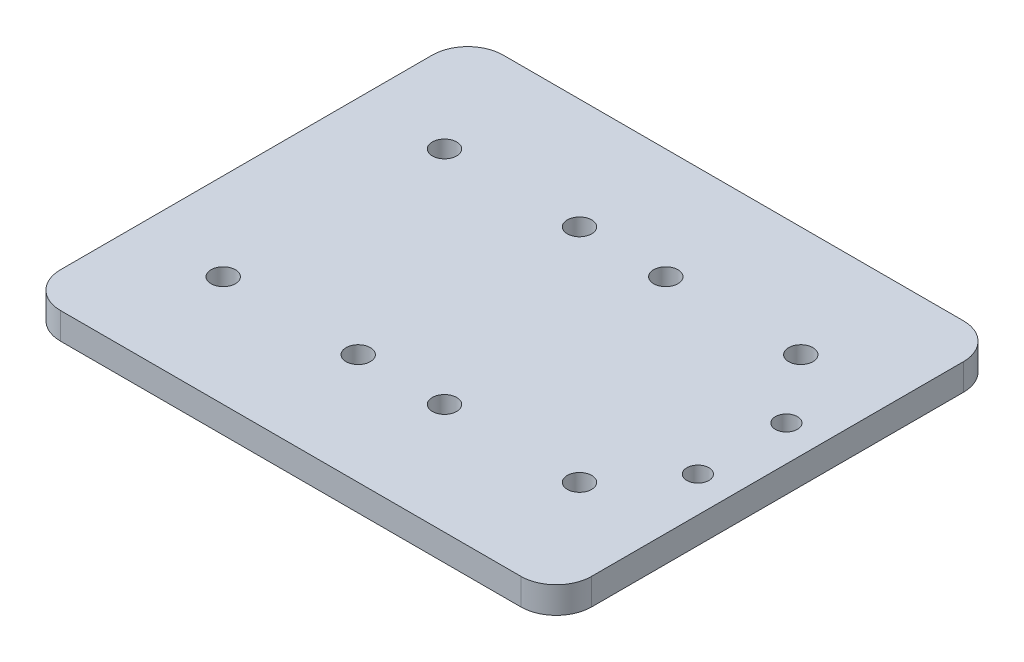
ISO-10303-21;
HEADER;
FILE_DESCRIPTION(('STEP AP214'),'2;1');
FILE_NAME('part.step','',(''),(''),'','','');
FILE_SCHEMA(('AUTOMOTIVE_DESIGN { 1 0 10303 214 1 1 1 1 }'));
ENDSEC;
DATA;
#1=APPLICATION_CONTEXT('core data for automotive mechanical design processes');
#2=APPLICATION_PROTOCOL_DEFINITION('international standard','automotive_design',2000,#1);
#3=PRODUCT_CONTEXT('',#1,'mechanical');
#4=PRODUCT('Part','Part','',(#3));
#5=PRODUCT_RELATED_PRODUCT_CATEGORY('part','',(#4));
#6=PRODUCT_DEFINITION_FORMATION('','',#4);
#7=PRODUCT_DEFINITION_CONTEXT('part definition',#1,'design');
#8=PRODUCT_DEFINITION('design','',#6,#7);
#9=PRODUCT_DEFINITION_SHAPE('','',#8);
#10=(LENGTH_UNIT() NAMED_UNIT(*) SI_UNIT(.MILLI.,.METRE.));
#11=(NAMED_UNIT(*) PLANE_ANGLE_UNIT() SI_UNIT($,.RADIAN.));
#12=(NAMED_UNIT(*) SI_UNIT($,.STERADIAN.) SOLID_ANGLE_UNIT());
#13=UNCERTAINTY_MEASURE_WITH_UNIT(LENGTH_MEASURE(1.E-05),#10,'distance_accuracy_value','');
#14=(GEOMETRIC_REPRESENTATION_CONTEXT(3) GLOBAL_UNCERTAINTY_ASSIGNED_CONTEXT((#13)) GLOBAL_UNIT_ASSIGNED_CONTEXT((#10,
#11,#12)) REPRESENTATION_CONTEXT('',''));
#15=CARTESIAN_POINT('',(0.,0.,0.));
#16=DIRECTION('',(0.,0.,1.));
#17=DIRECTION('',(1.,0.,0.));
#18=AXIS2_PLACEMENT_3D('',#15,#16,#17);
#19=CARTESIAN_POINT('',(60.,6.,-50.));
#20=DIRECTION('',(-1.,0.,0.));
#21=DIRECTION('',(0.,0.,1.));
#22=AXIS2_PLACEMENT_3D('',#19,#20,#21);
#23=PLANE('',#22);
#24=DIRECTION('',(0.,0.,-1.));
#25=VECTOR('',#24,1.);
#26=CARTESIAN_POINT('',(60.,0.,-50.));
#27=LINE('',#26,#25);
#28=CARTESIAN_POINT('',(60.,0.,42.));
#29=VERTEX_POINT('',#28);
#30=CARTESIAN_POINT('',(60.,0.,-42.));
#31=VERTEX_POINT('',#30);
#32=EDGE_CURVE('E133',#29,#31,#27,.T.);
#33=ORIENTED_EDGE('',*,*,#32,.T.);
#34=DIRECTION('',(0.,-1.,0.));
#35=VECTOR('',#34,1.);
#36=CARTESIAN_POINT('',(60.,6.,-42.));
#37=LINE('',#36,#35);
#38=CARTESIAN_POINT('',(60.,6.,-42.));
#39=VERTEX_POINT('',#38);
#40=EDGE_CURVE('E156',#31,#39,#37,.F.);
#41=ORIENTED_EDGE('',*,*,#40,.T.);
#42=DIRECTION('',(0.,0.,-1.));
#43=VECTOR('',#42,1.);
#44=CARTESIAN_POINT('',(60.,6.,-50.));
#45=LINE('',#44,#43);
#46=CARTESIAN_POINT('',(60.,6.,42.));
#47=VERTEX_POINT('',#46);
#48=EDGE_CURVE('E131',#47,#39,#45,.T.);
#49=ORIENTED_EDGE('',*,*,#48,.F.);
#50=DIRECTION('',(0.,-1.,0.));
#51=VECTOR('',#50,1.);
#52=CARTESIAN_POINT('',(60.,6.,42.));
#53=LINE('',#52,#51);
#54=EDGE_CURVE('E153',#47,#29,#53,.T.);
#55=ORIENTED_EDGE('',*,*,#54,.T.);
#56=EDGE_LOOP('',(#33,#41,#49,#55));
#57=FACE_BOUND('',#56,.T.);
#58=ADVANCED_FACE('F38',(#57),#23,.F.);
#59=CARTESIAN_POINT('',(-60.,6.,-50.));
#60=DIRECTION('',(0.,0.,1.));
#61=DIRECTION('',(1.,0.,0.));
#62=AXIS2_PLACEMENT_3D('',#59,#60,#61);
#63=PLANE('',#62);
#64=DIRECTION('',(-1.,0.,0.));
#65=VECTOR('',#64,1.);
#66=CARTESIAN_POINT('',(-60.,0.,-50.));
#67=LINE('',#66,#65);
#68=CARTESIAN_POINT('',(52.,0.,-50.));
#69=VERTEX_POINT('',#68);
#70=CARTESIAN_POINT('',(-52.,0.,-50.));
#71=VERTEX_POINT('',#70);
#72=EDGE_CURVE('E129',#69,#71,#67,.T.);
#73=ORIENTED_EDGE('',*,*,#72,.T.);
#74=DIRECTION('',(0.,-1.,0.));
#75=VECTOR('',#74,1.);
#76=CARTESIAN_POINT('',(-52.,6.,-50.));
#77=LINE('',#76,#75);
#78=CARTESIAN_POINT('',(-52.,6.,-50.));
#79=VERTEX_POINT('',#78);
#80=EDGE_CURVE('E108',#71,#79,#77,.F.);
#81=ORIENTED_EDGE('',*,*,#80,.T.);
#82=DIRECTION('',(-1.,0.,0.));
#83=VECTOR('',#82,1.);
#84=CARTESIAN_POINT('',(-60.,6.,-50.));
#85=LINE('',#84,#83);
#86=CARTESIAN_POINT('',(52.,6.,-50.));
#87=VERTEX_POINT('',#86);
#88=EDGE_CURVE('E172',#87,#79,#85,.T.);
#89=ORIENTED_EDGE('',*,*,#88,.F.);
#90=DIRECTION('',(0.,-1.,0.));
#91=VECTOR('',#90,1.);
#92=CARTESIAN_POINT('',(52.,6.,-50.));
#93=LINE('',#92,#91);
#94=EDGE_CURVE('E113',#87,#69,#93,.T.);
#95=ORIENTED_EDGE('',*,*,#94,.T.);
#96=EDGE_LOOP('',(#73,#81,#89,#95));
#97=FACE_BOUND('',#96,.T.);
#98=ADVANCED_FACE('F275',(#97),#63,.F.);
#99=CARTESIAN_POINT('',(-60.,6.,-50.));
#100=DIRECTION('',(1.,0.,0.));
#101=DIRECTION('',(0.,0.,-1.));
#102=AXIS2_PLACEMENT_3D('',#99,#100,#101);
#103=PLANE('',#102);
#104=DIRECTION('',(0.,0.,1.));
#105=VECTOR('',#104,1.);
#106=CARTESIAN_POINT('',(-60.,6.,-50.));
#107=LINE('',#106,#105);
#108=CARTESIAN_POINT('',(-60.,6.,-42.));
#109=VERTEX_POINT('',#108);
#110=CARTESIAN_POINT('',(-60.,6.,42.));
#111=VERTEX_POINT('',#110);
#112=EDGE_CURVE('E122',#109,#111,#107,.T.);
#113=ORIENTED_EDGE('',*,*,#112,.F.);
#114=DIRECTION('',(0.,-1.,0.));
#115=VECTOR('',#114,1.);
#116=CARTESIAN_POINT('',(-60.,6.,-42.));
#117=LINE('',#116,#115);
#118=CARTESIAN_POINT('',(-60.,0.,-42.));
#119=VERTEX_POINT('',#118);
#120=EDGE_CURVE('E107',#109,#119,#117,.T.);
#121=ORIENTED_EDGE('',*,*,#120,.T.);
#122=DIRECTION('',(0.,0.,1.));
#123=VECTOR('',#122,1.);
#124=CARTESIAN_POINT('',(-60.,0.,-50.));
#125=LINE('',#124,#123);
#126=CARTESIAN_POINT('',(-60.,0.,42.));
#127=VERTEX_POINT('',#126);
#128=EDGE_CURVE('E120',#119,#127,#125,.T.);
#129=ORIENTED_EDGE('',*,*,#128,.T.);
#130=DIRECTION('',(0.,-1.,0.));
#131=VECTOR('',#130,1.);
#132=CARTESIAN_POINT('',(-60.,6.,42.));
#133=LINE('',#132,#131);
#134=EDGE_CURVE('E124',#127,#111,#133,.F.);
#135=ORIENTED_EDGE('',*,*,#134,.T.);
#136=EDGE_LOOP('',(#113,#121,#129,#135));
#137=FACE_BOUND('',#136,.T.);
#138=ADVANCED_FACE('F119',(#137),#103,.F.);
#139=CARTESIAN_POINT('',(-60.,6.,50.));
#140=DIRECTION('',(0.,0.,-1.));
#141=DIRECTION('',(-1.,0.,0.));
#142=AXIS2_PLACEMENT_3D('',#139,#140,#141);
#143=PLANE('',#142);
#144=DIRECTION('',(1.,0.,0.));
#145=VECTOR('',#144,1.);
#146=CARTESIAN_POINT('',(-60.,0.,50.));
#147=LINE('',#146,#145);
#148=CARTESIAN_POINT('',(-52.,0.,50.));
#149=VERTEX_POINT('',#148);
#150=CARTESIAN_POINT('',(52.,0.,50.));
#151=VERTEX_POINT('',#150);
#152=EDGE_CURVE('E128',#149,#151,#147,.T.);
#153=ORIENTED_EDGE('',*,*,#152,.T.);
#154=DIRECTION('',(0.,-1.,0.));
#155=VECTOR('',#154,1.);
#156=CARTESIAN_POINT('',(52.,6.,50.));
#157=LINE('',#156,#155);
#158=CARTESIAN_POINT('',(52.,6.,50.));
#159=VERTEX_POINT('',#158);
#160=EDGE_CURVE('E11',#151,#159,#157,.F.);
#161=ORIENTED_EDGE('',*,*,#160,.T.);
#162=DIRECTION('',(1.,0.,0.));
#163=VECTOR('',#162,1.);
#164=CARTESIAN_POINT('',(-60.,6.,50.));
#165=LINE('',#164,#163);
#166=CARTESIAN_POINT('',(-52.,6.,50.));
#167=VERTEX_POINT('',#166);
#168=EDGE_CURVE('E137',#167,#159,#165,.T.);
#169=ORIENTED_EDGE('',*,*,#168,.F.);
#170=DIRECTION('',(0.,-1.,0.));
#171=VECTOR('',#170,1.);
#172=CARTESIAN_POINT('',(-52.,6.,50.));
#173=LINE('',#172,#171);
#174=EDGE_CURVE('E46',#167,#149,#173,.T.);
#175=ORIENTED_EDGE('',*,*,#174,.T.);
#176=EDGE_LOOP('',(#153,#161,#169,#175));
#177=FACE_BOUND('',#176,.T.);
#178=ADVANCED_FACE('F159',(#177),#143,.F.);
#179=CARTESIAN_POINT('',(0.,6.,0.));
#180=DIRECTION('',(0.,1.,0.));
#181=DIRECTION('',(0.,0.,1.));
#182=AXIS2_PLACEMENT_3D('',#179,#180,#181);
#183=PLANE('',#182);
#184=CARTESIAN_POINT('',(52.,6.,-10.));
#185=DIRECTION('',(0.,1.,0.));
#186=DIRECTION('',(0.,0.,1.));
#187=AXIS2_PLACEMENT_3D('',#184,#185,#186);
#188=CIRCLE('',#187,2.5);
#189=CARTESIAN_POINT('',(52.,6.,-7.5));
#190=VERTEX_POINT('',#189);
#191=EDGE_CURVE('E236',#190,#190,#188,.T.);
#192=ORIENTED_EDGE('',*,*,#191,.F.);
#193=EDGE_LOOP('',(#192));
#194=FACE_BOUND('',#193,.T.);
#195=CARTESIAN_POINT('',(52.,6.,9.99999999999999));
#196=DIRECTION('',(0.,1.,0.));
#197=DIRECTION('',(0.,0.,1.));
#198=AXIS2_PLACEMENT_3D('',#195,#196,#197);
#199=CIRCLE('',#198,2.5);
#200=CARTESIAN_POINT('',(52.,6.,12.5));
#201=VERTEX_POINT('',#200);
#202=EDGE_CURVE('E230',#201,#201,#199,.T.);
#203=ORIENTED_EDGE('',*,*,#202,.F.);
#204=EDGE_LOOP('',(#203));
#205=FACE_BOUND('',#204,.T.);
#206=CARTESIAN_POINT('',(-40.25,6.,25.));
#207=DIRECTION('',(0.,1.,0.));
#208=DIRECTION('',(0.,0.,-1.));
#209=AXIS2_PLACEMENT_3D('',#206,#207,#208);
#210=CIRCLE('',#209,2.75);
#211=CARTESIAN_POINT('',(-40.25,6.,22.25));
#212=VERTEX_POINT('',#211);
#213=EDGE_CURVE('E200',#212,#212,#210,.T.);
#214=ORIENTED_EDGE('',*,*,#213,.F.);
#215=EDGE_LOOP('',(#214));
#216=FACE_BOUND('',#215,.T.);
#217=CARTESIAN_POINT('',(40.25,6.,25.));
#218=DIRECTION('',(0.,1.,0.));
#219=DIRECTION('',(0.,0.,1.));
#220=AXIS2_PLACEMENT_3D('',#217,#218,#219);
#221=CIRCLE('',#220,2.75);
#222=CARTESIAN_POINT('',(40.25,6.,27.75));
#223=VERTEX_POINT('',#222);
#224=EDGE_CURVE('E207',#223,#223,#221,.T.);
#225=ORIENTED_EDGE('',*,*,#224,.F.);
#226=EDGE_LOOP('',(#225));
#227=FACE_BOUND('',#226,.T.);
#228=CARTESIAN_POINT('',(9.75000000000001,6.,25.));
#229=DIRECTION('',(0.,1.,0.));
#230=DIRECTION('',(0.,0.,1.));
#231=AXIS2_PLACEMENT_3D('',#228,#229,#230);
#232=CIRCLE('',#231,2.75);
#233=CARTESIAN_POINT('',(9.75000000000001,6.,27.75));
#234=VERTEX_POINT('',#233);
#235=EDGE_CURVE('E188',#234,#234,#232,.T.);
#236=ORIENTED_EDGE('',*,*,#235,.F.);
#237=EDGE_LOOP('',(#236));
#238=FACE_BOUND('',#237,.T.);
#239=CARTESIAN_POINT('',(40.25,6.,-25.));
#240=DIRECTION('',(0.,1.,0.));
#241=DIRECTION('',(0.,0.,1.));
#242=AXIS2_PLACEMENT_3D('',#239,#240,#241);
#243=CIRCLE('',#242,2.74999999999999);
#244=CARTESIAN_POINT('',(40.25,6.,-22.25));
#245=VERTEX_POINT('',#244);
#246=EDGE_CURVE('E195',#245,#245,#243,.T.);
#247=ORIENTED_EDGE('',*,*,#246,.F.);
#248=EDGE_LOOP('',(#247));
#249=FACE_BOUND('',#248,.T.);
#250=CARTESIAN_POINT('',(-9.75,6.,-25.));
#251=DIRECTION('',(0.,1.,0.));
#252=DIRECTION('',(0.,0.,-1.));
#253=AXIS2_PLACEMENT_3D('',#250,#251,#252);
#254=CIRCLE('',#253,2.75);
#255=CARTESIAN_POINT('',(-9.75,6.,-27.75));
#256=VERTEX_POINT('',#255);
#257=EDGE_CURVE('E224',#256,#256,#254,.T.);
#258=ORIENTED_EDGE('',*,*,#257,.F.);
#259=EDGE_LOOP('',(#258));
#260=FACE_BOUND('',#259,.T.);
#261=CARTESIAN_POINT('',(-40.25,6.,-25.));
#262=DIRECTION('',(0.,1.,0.));
#263=DIRECTION('',(0.,0.,-1.));
#264=AXIS2_PLACEMENT_3D('',#261,#262,#263);
#265=CIRCLE('',#264,2.74999999999999);
#266=CARTESIAN_POINT('',(-40.25,6.,-27.75));
#267=VERTEX_POINT('',#266);
#268=EDGE_CURVE('E212',#267,#267,#265,.T.);
#269=ORIENTED_EDGE('',*,*,#268,.F.);
#270=EDGE_LOOP('',(#269));
#271=FACE_BOUND('',#270,.T.);
#272=CARTESIAN_POINT('',(-9.75000000000001,6.,25.));
#273=DIRECTION('',(0.,1.,0.));
#274=DIRECTION('',(0.,0.,-1.));
#275=AXIS2_PLACEMENT_3D('',#272,#273,#274);
#276=CIRCLE('',#275,2.75);
#277=CARTESIAN_POINT('',(-9.75000000000001,6.,22.25));
#278=VERTEX_POINT('',#277);
#279=EDGE_CURVE('E219',#278,#278,#276,.T.);
#280=ORIENTED_EDGE('',*,*,#279,.F.);
#281=EDGE_LOOP('',(#280));
#282=FACE_BOUND('',#281,.T.);
#283=CARTESIAN_POINT('',(9.75,6.,-25.));
#284=DIRECTION('',(0.,1.,0.));
#285=DIRECTION('',(0.,0.,1.));
#286=AXIS2_PLACEMENT_3D('',#283,#284,#285);
#287=CIRCLE('',#286,2.75);
#288=CARTESIAN_POINT('',(9.75,6.,-22.25));
#289=VERTEX_POINT('',#288);
#290=EDGE_CURVE('E177',#289,#289,#287,.T.);
#291=ORIENTED_EDGE('',*,*,#290,.F.);
#292=EDGE_LOOP('',(#291));
#293=FACE_BOUND('',#292,.T.);
#294=ORIENTED_EDGE('',*,*,#88,.T.);
#295=CARTESIAN_POINT('',(-52.,6.,-42.));
#296=DIRECTION('',(0.,1.,0.));
#297=DIRECTION('',(0.,0.,1.));
#298=AXIS2_PLACEMENT_3D('',#295,#296,#297);
#299=CIRCLE('',#298,8.);
#300=EDGE_CURVE('E151',#79,#109,#299,.T.);
#301=ORIENTED_EDGE('',*,*,#300,.T.);
#302=ORIENTED_EDGE('',*,*,#112,.T.);
#303=CARTESIAN_POINT('',(-52.,6.,42.));
#304=DIRECTION('',(0.,1.,0.));
#305=DIRECTION('',(0.,0.,1.));
#306=AXIS2_PLACEMENT_3D('',#303,#304,#305);
#307=CIRCLE('',#306,8.);
#308=EDGE_CURVE('E58',#111,#167,#307,.T.);
#309=ORIENTED_EDGE('',*,*,#308,.T.);
#310=ORIENTED_EDGE('',*,*,#168,.T.);
#311=CARTESIAN_POINT('',(52.,6.,42.));
#312=DIRECTION('',(0.,1.,0.));
#313=DIRECTION('',(0.,0.,1.));
#314=AXIS2_PLACEMENT_3D('',#311,#312,#313);
#315=CIRCLE('',#314,8.);
#316=EDGE_CURVE('E147',#159,#47,#315,.T.);
#317=ORIENTED_EDGE('',*,*,#316,.T.);
#318=ORIENTED_EDGE('',*,*,#48,.T.);
#319=CARTESIAN_POINT('',(52.,6.,-42.));
#320=DIRECTION('',(0.,1.,0.));
#321=DIRECTION('',(0.,0.,1.));
#322=AXIS2_PLACEMENT_3D('',#319,#320,#321);
#323=CIRCLE('',#322,8.);
#324=EDGE_CURVE('E149',#39,#87,#323,.T.);
#325=ORIENTED_EDGE('',*,*,#324,.T.);
#326=EDGE_LOOP('',(#294,#301,#302,#309,#310,#317,#318,#325));
#327=FACE_BOUND('',#326,.T.);
#328=ADVANCED_FACE('F251',(#194,#205,#216,#227,#238,#249,#260,#271,#282,#293,#327),#183,.T.);
#329=CARTESIAN_POINT('',(0.,0.,0.));
#330=DIRECTION('',(0.,1.,0.));
#331=DIRECTION('',(0.,0.,1.));
#332=AXIS2_PLACEMENT_3D('',#329,#330,#331);
#333=PLANE('',#332);
#334=CARTESIAN_POINT('',(52.,0.,-10.));
#335=DIRECTION('',(0.,1.,0.));
#336=DIRECTION('',(0.,0.,1.));
#337=AXIS2_PLACEMENT_3D('',#334,#335,#336);
#338=CIRCLE('',#337,2.5);
#339=CARTESIAN_POINT('',(52.,0.,-7.5));
#340=VERTEX_POINT('',#339);
#341=EDGE_CURVE('E227',#340,#340,#338,.T.);
#342=ORIENTED_EDGE('',*,*,#341,.T.);
#343=EDGE_LOOP('',(#342));
#344=FACE_BOUND('',#343,.T.);
#345=CARTESIAN_POINT('',(52.,0.,9.99999999999999));
#346=DIRECTION('',(0.,1.,0.));
#347=DIRECTION('',(0.,0.,1.));
#348=AXIS2_PLACEMENT_3D('',#345,#346,#347);
#349=CIRCLE('',#348,2.5);
#350=CARTESIAN_POINT('',(52.,0.,12.5));
#351=VERTEX_POINT('',#350);
#352=EDGE_CURVE('E233',#351,#351,#349,.T.);
#353=ORIENTED_EDGE('',*,*,#352,.T.);
#354=EDGE_LOOP('',(#353));
#355=FACE_BOUND('',#354,.T.);
#356=CARTESIAN_POINT('',(-40.25,0.,25.));
#357=DIRECTION('',(0.,1.,0.));
#358=DIRECTION('',(0.,0.,-1.));
#359=AXIS2_PLACEMENT_3D('',#356,#357,#358);
#360=CIRCLE('',#359,2.75);
#361=CARTESIAN_POINT('',(-40.25,0.,22.25));
#362=VERTEX_POINT('',#361);
#363=EDGE_CURVE('E203',#362,#362,#360,.T.);
#364=ORIENTED_EDGE('',*,*,#363,.T.);
#365=EDGE_LOOP('',(#364));
#366=FACE_BOUND('',#365,.T.);
#367=CARTESIAN_POINT('',(40.25,0.,25.));
#368=DIRECTION('',(0.,1.,0.));
#369=DIRECTION('',(0.,0.,1.));
#370=AXIS2_PLACEMENT_3D('',#367,#368,#369);
#371=CIRCLE('',#370,2.75);
#372=CARTESIAN_POINT('',(40.25,0.,27.75));
#373=VERTEX_POINT('',#372);
#374=EDGE_CURVE('E192',#373,#373,#371,.T.);
#375=ORIENTED_EDGE('',*,*,#374,.T.);
#376=EDGE_LOOP('',(#375));
#377=FACE_BOUND('',#376,.T.);
#378=CARTESIAN_POINT('',(9.75000000000001,0.,25.));
#379=DIRECTION('',(0.,1.,0.));
#380=DIRECTION('',(0.,0.,1.));
#381=AXIS2_PLACEMENT_3D('',#378,#379,#380);
#382=CIRCLE('',#381,2.75);
#383=CARTESIAN_POINT('',(9.75000000000001,0.,27.75));
#384=VERTEX_POINT('',#383);
#385=EDGE_CURVE('E191',#384,#384,#382,.T.);
#386=ORIENTED_EDGE('',*,*,#385,.T.);
#387=EDGE_LOOP('',(#386));
#388=FACE_BOUND('',#387,.T.);
#389=CARTESIAN_POINT('',(40.25,0.,-25.));
#390=DIRECTION('',(0.,1.,0.));
#391=DIRECTION('',(0.,0.,1.));
#392=AXIS2_PLACEMENT_3D('',#389,#390,#391);
#393=CIRCLE('',#392,2.74999999999999);
#394=CARTESIAN_POINT('',(40.25,0.,-22.25));
#395=VERTEX_POINT('',#394);
#396=EDGE_CURVE('E186',#395,#395,#393,.T.);
#397=ORIENTED_EDGE('',*,*,#396,.T.);
#398=EDGE_LOOP('',(#397));
#399=FACE_BOUND('',#398,.T.);
#400=CARTESIAN_POINT('',(-9.75,0.,-25.));
#401=DIRECTION('',(0.,1.,0.));
#402=DIRECTION('',(0.,0.,-1.));
#403=AXIS2_PLACEMENT_3D('',#400,#401,#402);
#404=CIRCLE('',#403,2.75);
#405=CARTESIAN_POINT('',(-9.75,0.,-27.75));
#406=VERTEX_POINT('',#405);
#407=EDGE_CURVE('E216',#406,#406,#404,.T.);
#408=ORIENTED_EDGE('',*,*,#407,.T.);
#409=EDGE_LOOP('',(#408));
#410=FACE_BOUND('',#409,.T.);
#411=CARTESIAN_POINT('',(-40.25,0.,-25.));
#412=DIRECTION('',(0.,1.,0.));
#413=DIRECTION('',(0.,0.,-1.));
#414=AXIS2_PLACEMENT_3D('',#411,#412,#413);
#415=CIRCLE('',#414,2.74999999999999);
#416=CARTESIAN_POINT('',(-40.25,0.,-27.75));
#417=VERTEX_POINT('',#416);
#418=EDGE_CURVE('E215',#417,#417,#415,.T.);
#419=ORIENTED_EDGE('',*,*,#418,.T.);
#420=EDGE_LOOP('',(#419));
#421=FACE_BOUND('',#420,.T.);
#422=CARTESIAN_POINT('',(-9.75000000000001,0.,25.));
#423=DIRECTION('',(0.,1.,0.));
#424=DIRECTION('',(0.,0.,-1.));
#425=AXIS2_PLACEMENT_3D('',#422,#423,#424);
#426=CIRCLE('',#425,2.75);
#427=CARTESIAN_POINT('',(-9.75000000000001,0.,22.25));
#428=VERTEX_POINT('',#427);
#429=EDGE_CURVE('E204',#428,#428,#426,.T.);
#430=ORIENTED_EDGE('',*,*,#429,.T.);
#431=EDGE_LOOP('',(#430));
#432=FACE_BOUND('',#431,.T.);
#433=CARTESIAN_POINT('',(9.75,0.,-25.));
#434=DIRECTION('',(0.,1.,0.));
#435=DIRECTION('',(0.,0.,1.));
#436=AXIS2_PLACEMENT_3D('',#433,#434,#435);
#437=CIRCLE('',#436,2.75);
#438=CARTESIAN_POINT('',(9.75,0.,-22.25));
#439=VERTEX_POINT('',#438);
#440=EDGE_CURVE('E181',#439,#439,#437,.T.);
#441=ORIENTED_EDGE('',*,*,#440,.T.);
#442=EDGE_LOOP('',(#441));
#443=FACE_BOUND('',#442,.T.);
#444=ORIENTED_EDGE('',*,*,#128,.F.);
#445=CARTESIAN_POINT('',(-52.,0.,-42.));
#446=DIRECTION('',(0.,1.,0.));
#447=DIRECTION('',(0.,0.,1.));
#448=AXIS2_PLACEMENT_3D('',#445,#446,#447);
#449=CIRCLE('',#448,8.);
#450=EDGE_CURVE('E103',#119,#71,#449,.F.);
#451=ORIENTED_EDGE('',*,*,#450,.T.);
#452=ORIENTED_EDGE('',*,*,#72,.F.);
#453=CARTESIAN_POINT('',(52.,0.,-42.));
#454=DIRECTION('',(0.,1.,0.));
#455=DIRECTION('',(0.,0.,1.));
#456=AXIS2_PLACEMENT_3D('',#453,#454,#455);
#457=CIRCLE('',#456,8.);
#458=EDGE_CURVE('E114',#69,#31,#457,.F.);
#459=ORIENTED_EDGE('',*,*,#458,.T.);
#460=ORIENTED_EDGE('',*,*,#32,.F.);
#461=CARTESIAN_POINT('',(52.,0.,42.));
#462=DIRECTION('',(0.,1.,0.));
#463=DIRECTION('',(0.,0.,1.));
#464=AXIS2_PLACEMENT_3D('',#461,#462,#463);
#465=CIRCLE('',#464,8.);
#466=EDGE_CURVE('E140',#29,#151,#465,.F.);
#467=ORIENTED_EDGE('',*,*,#466,.T.);
#468=ORIENTED_EDGE('',*,*,#152,.F.);
#469=CARTESIAN_POINT('',(-52.,0.,42.));
#470=DIRECTION('',(0.,1.,0.));
#471=DIRECTION('',(0.,0.,1.));
#472=AXIS2_PLACEMENT_3D('',#469,#470,#471);
#473=CIRCLE('',#472,8.);
#474=EDGE_CURVE('E123',#149,#127,#473,.F.);
#475=ORIENTED_EDGE('',*,*,#474,.T.);
#476=EDGE_LOOP('',(#444,#451,#452,#459,#460,#467,#468,#475));
#477=FACE_BOUND('',#476,.T.);
#478=ADVANCED_FACE('F126',(#344,#355,#366,#377,#388,#399,#410,#421,#432,#443,#477),#333,.F.);
#479=CARTESIAN_POINT('',(9.75,0.,-25.));
#480=DIRECTION('',(0.,1.,0.));
#481=DIRECTION('',(0.,0.,1.));
#482=AXIS2_PLACEMENT_3D('',#479,#480,#481);
#483=CYLINDRICAL_SURFACE('',#482,2.75);
#484=ORIENTED_EDGE('',*,*,#440,.F.);
#485=EDGE_LOOP('',(#484));
#486=FACE_BOUND('',#485,.T.);
#487=ORIENTED_EDGE('',*,*,#290,.T.);
#488=EDGE_LOOP('',(#487));
#489=FACE_BOUND('',#488,.T.);
#490=ADVANCED_FACE('F298',(#486,#489),#483,.F.);
#491=CARTESIAN_POINT('',(-9.75000000000001,0.,25.));
#492=DIRECTION('',(0.,1.,0.));
#493=DIRECTION('',(0.,0.,1.));
#494=AXIS2_PLACEMENT_3D('',#491,#492,#493);
#495=CYLINDRICAL_SURFACE('',#494,2.75);
#496=ORIENTED_EDGE('',*,*,#429,.F.);
#497=EDGE_LOOP('',(#496));
#498=FACE_BOUND('',#497,.T.);
#499=ORIENTED_EDGE('',*,*,#279,.T.);
#500=EDGE_LOOP('',(#499));
#501=FACE_BOUND('',#500,.T.);
#502=ADVANCED_FACE('F302',(#498,#501),#495,.F.);
#503=CARTESIAN_POINT('',(-40.25,0.,-25.));
#504=DIRECTION('',(0.,1.,0.));
#505=DIRECTION('',(0.,0.,1.));
#506=AXIS2_PLACEMENT_3D('',#503,#504,#505);
#507=CYLINDRICAL_SURFACE('',#506,2.74999999999999);
#508=ORIENTED_EDGE('',*,*,#418,.F.);
#509=EDGE_LOOP('',(#508));
#510=FACE_BOUND('',#509,.T.);
#511=ORIENTED_EDGE('',*,*,#268,.T.);
#512=EDGE_LOOP('',(#511));
#513=FACE_BOUND('',#512,.T.);
#514=ADVANCED_FACE('F320',(#510,#513),#507,.F.);
#515=CARTESIAN_POINT('',(-9.75,0.,-25.));
#516=DIRECTION('',(0.,1.,0.));
#517=DIRECTION('',(0.,0.,1.));
#518=AXIS2_PLACEMENT_3D('',#515,#516,#517);
#519=CYLINDRICAL_SURFACE('',#518,2.75);
#520=ORIENTED_EDGE('',*,*,#407,.F.);
#521=EDGE_LOOP('',(#520));
#522=FACE_BOUND('',#521,.T.);
#523=ORIENTED_EDGE('',*,*,#257,.T.);
#524=EDGE_LOOP('',(#523));
#525=FACE_BOUND('',#524,.T.);
#526=ADVANCED_FACE('F312',(#522,#525),#519,.F.);
#527=CARTESIAN_POINT('',(40.25,0.,-25.));
#528=DIRECTION('',(0.,1.,0.));
#529=DIRECTION('',(0.,0.,1.));
#530=AXIS2_PLACEMENT_3D('',#527,#528,#529);
#531=CYLINDRICAL_SURFACE('',#530,2.74999999999999);
#532=ORIENTED_EDGE('',*,*,#396,.F.);
#533=EDGE_LOOP('',(#532));
#534=FACE_BOUND('',#533,.T.);
#535=ORIENTED_EDGE('',*,*,#246,.T.);
#536=EDGE_LOOP('',(#535));
#537=FACE_BOUND('',#536,.T.);
#538=ADVANCED_FACE('F308',(#534,#537),#531,.F.);
#539=CARTESIAN_POINT('',(9.75000000000001,0.,25.));
#540=DIRECTION('',(0.,1.,0.));
#541=DIRECTION('',(0.,0.,1.));
#542=AXIS2_PLACEMENT_3D('',#539,#540,#541);
#543=CYLINDRICAL_SURFACE('',#542,2.75);
#544=ORIENTED_EDGE('',*,*,#385,.F.);
#545=EDGE_LOOP('',(#544));
#546=FACE_BOUND('',#545,.T.);
#547=ORIENTED_EDGE('',*,*,#235,.T.);
#548=EDGE_LOOP('',(#547));
#549=FACE_BOUND('',#548,.T.);
#550=ADVANCED_FACE('F304',(#546,#549),#543,.F.);
#551=CARTESIAN_POINT('',(40.25,0.,25.));
#552=DIRECTION('',(0.,1.,0.));
#553=DIRECTION('',(0.,0.,1.));
#554=AXIS2_PLACEMENT_3D('',#551,#552,#553);
#555=CYLINDRICAL_SURFACE('',#554,2.75);
#556=ORIENTED_EDGE('',*,*,#374,.F.);
#557=EDGE_LOOP('',(#556));
#558=FACE_BOUND('',#557,.T.);
#559=ORIENTED_EDGE('',*,*,#224,.T.);
#560=EDGE_LOOP('',(#559));
#561=FACE_BOUND('',#560,.T.);
#562=ADVANCED_FACE('F307',(#558,#561),#555,.F.);
#563=CARTESIAN_POINT('',(-40.25,0.,25.));
#564=DIRECTION('',(0.,1.,0.));
#565=DIRECTION('',(0.,0.,1.));
#566=AXIS2_PLACEMENT_3D('',#563,#564,#565);
#567=CYLINDRICAL_SURFACE('',#566,2.75);
#568=ORIENTED_EDGE('',*,*,#363,.F.);
#569=EDGE_LOOP('',(#568));
#570=FACE_BOUND('',#569,.T.);
#571=ORIENTED_EDGE('',*,*,#213,.T.);
#572=EDGE_LOOP('',(#571));
#573=FACE_BOUND('',#572,.T.);
#574=ADVANCED_FACE('F284',(#570,#573),#567,.F.);
#575=CARTESIAN_POINT('',(-52.,6.,-42.));
#576=DIRECTION('',(0.,-1.,0.));
#577=DIRECTION('',(0.,0.,-1.));
#578=AXIS2_PLACEMENT_3D('',#575,#576,#577);
#579=CYLINDRICAL_SURFACE('',#578,8.);
#580=ORIENTED_EDGE('',*,*,#300,.F.);
#581=ORIENTED_EDGE('',*,*,#80,.F.);
#582=ORIENTED_EDGE('',*,*,#450,.F.);
#583=ORIENTED_EDGE('',*,*,#120,.F.);
#584=EDGE_LOOP('',(#580,#581,#582,#583));
#585=FACE_BOUND('',#584,.T.);
#586=ADVANCED_FACE('F106',(#585),#579,.T.);
#587=CARTESIAN_POINT('',(52.,6.,-42.));
#588=DIRECTION('',(0.,-1.,0.));
#589=DIRECTION('',(0.,0.,-1.));
#590=AXIS2_PLACEMENT_3D('',#587,#588,#589);
#591=CYLINDRICAL_SURFACE('',#590,8.);
#592=ORIENTED_EDGE('',*,*,#324,.F.);
#593=ORIENTED_EDGE('',*,*,#40,.F.);
#594=ORIENTED_EDGE('',*,*,#458,.F.);
#595=ORIENTED_EDGE('',*,*,#94,.F.);
#596=EDGE_LOOP('',(#592,#593,#594,#595));
#597=FACE_BOUND('',#596,.T.);
#598=ADVANCED_FACE('F277',(#597),#591,.T.);
#599=CARTESIAN_POINT('',(52.,6.,42.));
#600=DIRECTION('',(0.,-1.,0.));
#601=DIRECTION('',(0.,0.,-1.));
#602=AXIS2_PLACEMENT_3D('',#599,#600,#601);
#603=CYLINDRICAL_SURFACE('',#602,8.);
#604=ORIENTED_EDGE('',*,*,#316,.F.);
#605=ORIENTED_EDGE('',*,*,#160,.F.);
#606=ORIENTED_EDGE('',*,*,#466,.F.);
#607=ORIENTED_EDGE('',*,*,#54,.F.);
#608=EDGE_LOOP('',(#604,#605,#606,#607));
#609=FACE_BOUND('',#608,.T.);
#610=ADVANCED_FACE('F166',(#609),#603,.T.);
#611=CARTESIAN_POINT('',(-52.,6.,42.));
#612=DIRECTION('',(0.,-1.,0.));
#613=DIRECTION('',(0.,0.,-1.));
#614=AXIS2_PLACEMENT_3D('',#611,#612,#613);
#615=CYLINDRICAL_SURFACE('',#614,8.);
#616=ORIENTED_EDGE('',*,*,#308,.F.);
#617=ORIENTED_EDGE('',*,*,#134,.F.);
#618=ORIENTED_EDGE('',*,*,#474,.F.);
#619=ORIENTED_EDGE('',*,*,#174,.F.);
#620=EDGE_LOOP('',(#616,#617,#618,#619));
#621=FACE_BOUND('',#620,.T.);
#622=ADVANCED_FACE('F40',(#621),#615,.T.);
#623=CARTESIAN_POINT('',(52.,0.,9.99999999999999));
#624=DIRECTION('',(0.,1.,0.));
#625=DIRECTION('',(0.,0.,1.));
#626=AXIS2_PLACEMENT_3D('',#623,#624,#625);
#627=CYLINDRICAL_SURFACE('',#626,2.5);
#628=ORIENTED_EDGE('',*,*,#352,.F.);
#629=EDGE_LOOP('',(#628));
#630=FACE_BOUND('',#629,.T.);
#631=ORIENTED_EDGE('',*,*,#202,.T.);
#632=EDGE_LOOP('',(#631));
#633=FACE_BOUND('',#632,.T.);
#634=ADVANCED_FACE('F247',(#630,#633),#627,.F.);
#635=CARTESIAN_POINT('',(52.,0.,-10.));
#636=DIRECTION('',(0.,1.,0.));
#637=DIRECTION('',(0.,0.,1.));
#638=AXIS2_PLACEMENT_3D('',#635,#636,#637);
#639=CYLINDRICAL_SURFACE('',#638,2.5);
#640=ORIENTED_EDGE('',*,*,#341,.F.);
#641=EDGE_LOOP('',(#640));
#642=FACE_BOUND('',#641,.T.);
#643=ORIENTED_EDGE('',*,*,#191,.T.);
#644=EDGE_LOOP('',(#643));
#645=FACE_BOUND('',#644,.T.);
#646=ADVANCED_FACE('F244',(#642,#645),#639,.F.);
#647=CLOSED_SHELL('',(#58,#98,#138,#178,#328,#478,#490,#502,#514,#526,#538,#550,#562,#574,#586,
#598,#610,#622,#634,#646));
#648=MANIFOLD_SOLID_BREP('B2',#647);
#649=ADVANCED_BREP_SHAPE_REPRESENTATION('',(#18,#648),#14);
#650=SHAPE_DEFINITION_REPRESENTATION(#9,#649);
ENDSEC;
END-ISO-10303-21;
